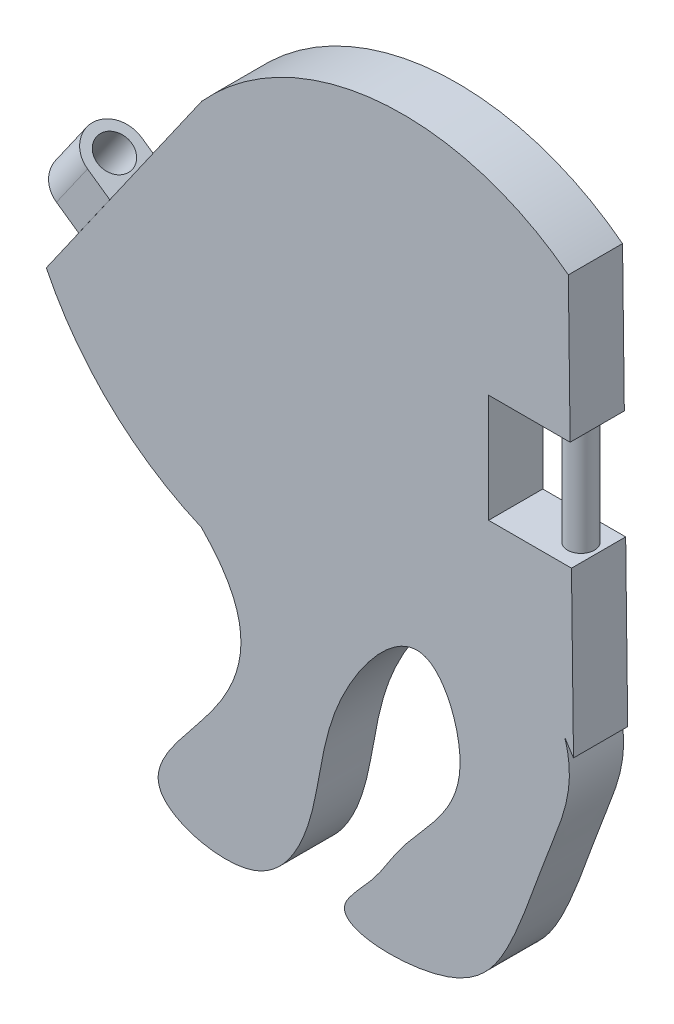
ISO-10303-21;
HEADER;
FILE_DESCRIPTION(('STEP AP214'),'2;1');
FILE_NAME('part.step','',(''),(''),'','','');
FILE_SCHEMA(('AUTOMOTIVE_DESIGN { 1 0 10303 214 1 1 1 1 }'));
ENDSEC;
DATA;
#1=APPLICATION_CONTEXT('core data for automotive mechanical design processes');
#2=APPLICATION_PROTOCOL_DEFINITION('international standard','automotive_design',2000,#1);
#3=PRODUCT_CONTEXT('',#1,'mechanical');
#4=PRODUCT('Part','Part','',(#3));
#5=PRODUCT_RELATED_PRODUCT_CATEGORY('part','',(#4));
#6=PRODUCT_DEFINITION_FORMATION('','',#4);
#7=PRODUCT_DEFINITION_CONTEXT('part definition',#1,'design');
#8=PRODUCT_DEFINITION('design','',#6,#7);
#9=PRODUCT_DEFINITION_SHAPE('','',#8);
#10=(LENGTH_UNIT() NAMED_UNIT(*) SI_UNIT(.MILLI.,.METRE.));
#11=(NAMED_UNIT(*) PLANE_ANGLE_UNIT() SI_UNIT($,.RADIAN.));
#12=(NAMED_UNIT(*) SI_UNIT($,.STERADIAN.) SOLID_ANGLE_UNIT());
#13=UNCERTAINTY_MEASURE_WITH_UNIT(LENGTH_MEASURE(1.E-05),#10,'distance_accuracy_value','');
#14=(GEOMETRIC_REPRESENTATION_CONTEXT(3) GLOBAL_UNCERTAINTY_ASSIGNED_CONTEXT((#13)) GLOBAL_UNIT_ASSIGNED_CONTEXT((#10,
#11,#12)) REPRESENTATION_CONTEXT('',''));
#15=CARTESIAN_POINT('',(0.,0.,0.));
#16=DIRECTION('',(0.,0.,1.));
#17=DIRECTION('',(1.,0.,0.));
#18=AXIS2_PLACEMENT_3D('',#15,#16,#17);
#19=CARTESIAN_POINT('',(-52.7839333186767,28.0995546396019,3.03373966602649));
#20=DIRECTION('',(-0.57357643635105,-0.819152044288989,0.));
#21=DIRECTION('',(0.819152044288989,-0.57357643635105,0.));
#22=AXIS2_PLACEMENT_3D('',#19,#20,#21);
#23=CYLINDRICAL_SURFACE('',#22,3.);
#24=CARTESIAN_POINT('',(-56.225391936783,23.184642373868,3.03373966602649));
#25=DIRECTION('',(0.57357643635105,0.819152044288989,0.));
#26=DIRECTION('',(-0.819152044288989,0.57357643635105,0.));
#27=AXIS2_PLACEMENT_3D('',#24,#25,#26);
#28=CIRCLE('',#27,3.);
#29=CARTESIAN_POINT('',(-56.225391936783,23.184642373868,0.0337396660264923));
#30=VERTEX_POINT('',#29);
#31=CARTESIAN_POINT('',(-56.225391936783,23.184642373868,6.03373966602649));
#32=VERTEX_POINT('',#31);
#33=EDGE_CURVE('E117',#30,#32,#28,.T.);
#34=ORIENTED_EDGE('',*,*,#33,.T.);
#35=DIRECTION('',(-0.57357643635105,-0.819152044288989,0.));
#36=VECTOR('',#35,1.);
#37=CARTESIAN_POINT('',(-52.7839333186767,28.0995546396019,6.03373966602649));
#38=LINE('',#37,#36);
#39=CARTESIAN_POINT('',(-52.7839333186767,28.0995546396019,6.03373966602649));
#40=VERTEX_POINT('',#39);
#41=EDGE_CURVE('E12',#40,#32,#38,.T.);
#42=ORIENTED_EDGE('',*,*,#41,.F.);
#43=CARTESIAN_POINT('',(-52.7839333186767,28.0995546396019,3.03373966602649));
#44=DIRECTION('',(0.57357643635105,0.819152044288989,0.));
#45=DIRECTION('',(-0.819152044288989,0.57357643635105,0.));
#46=AXIS2_PLACEMENT_3D('',#43,#44,#45);
#47=CIRCLE('',#46,3.);
#48=CARTESIAN_POINT('',(-52.7839333186767,28.0995546396019,0.0337396660264923));
#49=VERTEX_POINT('',#48);
#50=EDGE_CURVE('E106',#49,#40,#47,.T.);
#51=ORIENTED_EDGE('',*,*,#50,.F.);
#52=DIRECTION('',(-0.57357643635105,-0.819152044288989,0.));
#53=VECTOR('',#52,1.);
#54=CARTESIAN_POINT('',(-52.7839333186767,28.0995546396019,0.0337396660264923));
#55=LINE('',#54,#53);
#56=EDGE_CURVE('E112',#49,#30,#55,.T.);
#57=ORIENTED_EDGE('',*,*,#56,.T.);
#58=EDGE_LOOP('',(#34,#42,#51,#57));
#59=FACE_BOUND('',#58,.T.);
#60=ADVANCED_FACE('F54',(#59),#23,.T.);
#61=CARTESIAN_POINT('',(-52.7839333186767,28.0995546396019,6.03373966602649));
#62=DIRECTION('',(0.,0.,-1.));
#63=DIRECTION('',(-1.,0.,0.));
#64=AXIS2_PLACEMENT_3D('',#61,#62,#63);
#65=PLANE('',#64);
#66=DIRECTION('',(0.819152044288989,-0.57357643635105,0.));
#67=VECTOR('',#66,1.);
#68=CARTESIAN_POINT('',(-56.225391936783,23.184642373868,6.03373966602649));
#69=LINE('',#68,#67);
#70=CARTESIAN_POINT('',(-53.767935803916,21.4639130648148,6.03373966602649));
#71=VERTEX_POINT('',#70);
#72=EDGE_CURVE('E109',#32,#71,#69,.T.);
#73=ORIENTED_EDGE('',*,*,#72,.T.);
#74=DIRECTION('',(-0.57357643635105,-0.819152044288989,0.));
#75=VECTOR('',#74,1.);
#76=CARTESIAN_POINT('',(-50.3264771858097,26.3788253305488,6.03373966602649));
#77=LINE('',#76,#75);
#78=CARTESIAN_POINT('',(-50.3264771858097,26.3788253305488,6.03373966602649));
#79=VERTEX_POINT('',#78);
#80=EDGE_CURVE('E64',#79,#71,#77,.T.);
#81=ORIENTED_EDGE('',*,*,#80,.F.);
#82=DIRECTION('',(0.819152044288989,-0.57357643635105,0.));
#83=VECTOR('',#82,1.);
#84=CARTESIAN_POINT('',(-52.7839333186767,28.0995546396019,6.03373966602649));
#85=LINE('',#84,#83);
#86=EDGE_CURVE('E103',#40,#79,#85,.T.);
#87=ORIENTED_EDGE('',*,*,#86,.F.);
#88=ORIENTED_EDGE('',*,*,#41,.T.);
#89=EDGE_LOOP('',(#73,#81,#87,#88));
#90=FACE_BOUND('',#89,.T.);
#91=ADVANCED_FACE('F107',(#90),#65,.F.);
#92=CARTESIAN_POINT('',(-50.3264771858097,26.3788253305488,6.03373966602649));
#93=DIRECTION('',(-0.819152044288989,0.57357643635105,0.));
#94=DIRECTION('',(-0.57357643635105,-0.819152044288989,0.));
#95=AXIS2_PLACEMENT_3D('',#92,#93,#94);
#96=PLANE('',#95);
#97=DIRECTION('',(0.,0.,-1.));
#98=VECTOR('',#97,1.);
#99=CARTESIAN_POINT('',(-53.767935803916,21.4639130648148,6.03373966602649));
#100=LINE('',#99,#98);
#101=CARTESIAN_POINT('',(-53.767935803916,21.4639130648148,0.0337396660264923));
#102=VERTEX_POINT('',#101);
#103=EDGE_CURVE('E89',#71,#102,#100,.T.);
#104=ORIENTED_EDGE('',*,*,#103,.T.);
#105=DIRECTION('',(-0.57357643635105,-0.819152044288989,0.));
#106=VECTOR('',#105,1.);
#107=CARTESIAN_POINT('',(-50.3264771858097,26.3788253305488,0.0337396660264923));
#108=LINE('',#107,#106);
#109=CARTESIAN_POINT('',(-50.3264771858097,26.3788253305488,0.0337396660264923));
#110=VERTEX_POINT('',#109);
#111=EDGE_CURVE('E111',#110,#102,#108,.T.);
#112=ORIENTED_EDGE('',*,*,#111,.F.);
#113=DIRECTION('',(0.,0.,-1.));
#114=VECTOR('',#113,1.);
#115=CARTESIAN_POINT('',(-50.3264771858097,26.3788253305488,6.03373966602649));
#116=LINE('',#115,#114);
#117=EDGE_CURVE('E104',#79,#110,#116,.T.);
#118=ORIENTED_EDGE('',*,*,#117,.F.);
#119=ORIENTED_EDGE('',*,*,#80,.T.);
#120=EDGE_LOOP('',(#104,#112,#118,#119));
#121=FACE_BOUND('',#120,.T.);
#122=ADVANCED_FACE('F115',(#121),#96,.F.);
#123=CARTESIAN_POINT('',(-52.7839333186767,28.0995546396019,0.0337396660264923));
#124=DIRECTION('',(0.,0.,1.));
#125=DIRECTION('',(1.,0.,0.));
#126=AXIS2_PLACEMENT_3D('',#123,#124,#125);
#127=PLANE('',#126);
#128=DIRECTION('',(-0.819152044288989,0.57357643635105,0.));
#129=VECTOR('',#128,1.);
#130=CARTESIAN_POINT('',(-56.225391936783,23.184642373868,0.0337396660264923));
#131=LINE('',#130,#129);
#132=EDGE_CURVE('E95',#102,#30,#131,.T.);
#133=ORIENTED_EDGE('',*,*,#132,.T.);
#134=ORIENTED_EDGE('',*,*,#56,.F.);
#135=DIRECTION('',(-0.819152044288989,0.57357643635105,0.));
#136=VECTOR('',#135,1.);
#137=CARTESIAN_POINT('',(-52.7839333186767,28.0995546396019,0.0337396660264923));
#138=LINE('',#137,#136);
#139=EDGE_CURVE('E73',#110,#49,#138,.T.);
#140=ORIENTED_EDGE('',*,*,#139,.F.);
#141=ORIENTED_EDGE('',*,*,#111,.T.);
#142=EDGE_LOOP('',(#133,#134,#140,#141));
#143=FACE_BOUND('',#142,.T.);
#144=ADVANCED_FACE('F127',(#143),#127,.F.);
#145=CARTESIAN_POINT('',(-52.7839333186767,28.0995546396019,3.03373966602649));
#146=DIRECTION('',(0.57357643635105,0.819152044288989,0.));
#147=DIRECTION('',(-0.819152044288989,0.57357643635105,0.));
#148=AXIS2_PLACEMENT_3D('',#145,#146,#147);
#149=PLANE('',#148);
#150=CARTESIAN_POINT('',(-52.8064758772176,28.1153391090228,3.03373966602649));
#151=DIRECTION('',(0.57357643635105,0.819152044288989,0.));
#152=DIRECTION('',(-0.819152044288989,0.57357643635105,0.));
#153=AXIS2_PLACEMENT_3D('',#150,#151,#152);
#154=CIRCLE('',#153,1.9);
#155=CARTESIAN_POINT('',(-54.3628647613667,29.2051343380898,3.03373966602649));
#156=VERTEX_POINT('',#155);
#157=EDGE_CURVE('E135',#156,#156,#154,.T.);
#158=ORIENTED_EDGE('',*,*,#157,.F.);
#159=EDGE_LOOP('',(#158));
#160=FACE_BOUND('',#159,.T.);
#161=ORIENTED_EDGE('',*,*,#50,.T.);
#162=ORIENTED_EDGE('',*,*,#86,.T.);
#163=ORIENTED_EDGE('',*,*,#117,.T.);
#164=ORIENTED_EDGE('',*,*,#139,.T.);
#165=EDGE_LOOP('',(#161,#162,#163,#164));
#166=FACE_BOUND('',#165,.T.);
#167=ADVANCED_FACE('F105',(#160,#166),#149,.T.);
#168=CARTESIAN_POINT('',(-56.225391936783,23.184642373868,3.03373966602649));
#169=DIRECTION('',(0.57357643635105,0.819152044288989,0.));
#170=DIRECTION('',(-0.819152044288989,0.57357643635105,0.));
#171=AXIS2_PLACEMENT_3D('',#168,#169,#170);
#172=PLANE('',#171);
#173=CARTESIAN_POINT('',(-56.2479344953239,23.2004268432889,3.03373966602649));
#174=DIRECTION('',(0.57357643635105,0.819152044288989,0.));
#175=DIRECTION('',(-0.819152044288989,0.57357643635105,0.));
#176=AXIS2_PLACEMENT_3D('',#173,#174,#175);
#177=CIRCLE('',#176,1.9);
#178=CARTESIAN_POINT('',(-57.804323379473,24.2902220723559,3.03373966602649));
#179=VERTEX_POINT('',#178);
#180=EDGE_CURVE('E122',#179,#179,#177,.T.);
#181=ORIENTED_EDGE('',*,*,#180,.T.);
#182=EDGE_LOOP('',(#181));
#183=FACE_BOUND('',#182,.T.);
#184=ORIENTED_EDGE('',*,*,#33,.F.);
#185=ORIENTED_EDGE('',*,*,#132,.F.);
#186=ORIENTED_EDGE('',*,*,#103,.F.);
#187=ORIENTED_EDGE('',*,*,#72,.F.);
#188=EDGE_LOOP('',(#184,#185,#186,#187));
#189=FACE_BOUND('',#188,.T.);
#190=ADVANCED_FACE('F126',(#183,#189),#172,.F.);
#191=CARTESIAN_POINT('',(-56.2479344953239,23.2004268432889,3.03373966602649));
#192=DIRECTION('',(0.57357643635105,0.819152044288989,0.));
#193=DIRECTION('',(-0.819152044288989,0.57357643635105,0.));
#194=AXIS2_PLACEMENT_3D('',#191,#192,#193);
#195=CYLINDRICAL_SURFACE('',#194,1.9);
#196=CARTESIAN_POINT('',(-57.804323379473,24.2902220723559,3.03373966602649));
#197=CARTESIAN_POINT('',(-57.7684748522011,24.341419075124,3.03373966602649));
#198=CARTESIAN_POINT('',(-57.7326263249291,24.392616077892,3.03373966602649));
#199=CARTESIAN_POINT('',(-57.6609292703853,24.4950100834282,3.03373966602649));
#200=CARTESIAN_POINT('',(-57.6250807431133,24.5462070861962,3.03373966602649));
#201=CARTESIAN_POINT('',(-57.5533836885694,24.6486010917323,3.03373966602649));
#202=CARTESIAN_POINT('',(-57.5175351612975,24.6997980945004,3.03373966602649));
#203=CARTESIAN_POINT('',(-57.4458381067536,24.8021921000365,3.03373966602649));
#204=CARTESIAN_POINT('',(-57.4099895794817,24.8533891028046,3.03373966602649));
#205=CARTESIAN_POINT('',(-57.3382925249378,24.9557831083407,3.03373966602649));
#206=CARTESIAN_POINT('',(-57.3024439976658,25.0069801111088,3.03373966602649));
#207=CARTESIAN_POINT('',(-57.230746943122,25.1093741166449,3.03373966602649));
#208=CARTESIAN_POINT('',(-57.19489841585,25.160571119413,3.03373966602649));
#209=CARTESIAN_POINT('',(-57.1232013613062,25.2629651249491,3.03373966602649));
#210=CARTESIAN_POINT('',(-57.0873528340342,25.3141621277171,3.03373966602649));
#211=CARTESIAN_POINT('',(-57.0156557794903,25.4165561332533,3.03373966602649));
#212=CARTESIAN_POINT('',(-56.9798072522184,25.4677531360213,3.03373966602649));
#213=CARTESIAN_POINT('',(-56.9081101976745,25.5701471415575,3.03373966602649));
#214=CARTESIAN_POINT('',(-56.8722616704026,25.6213441443255,3.03373966602649));
#215=CARTESIAN_POINT('',(-56.8005646158587,25.7237381498616,3.03373966602649));
#216=CARTESIAN_POINT('',(-56.7647160885867,25.7749351526297,3.03373966602649));
#217=CARTESIAN_POINT('',(-56.6930190340429,25.8773291581658,3.03373966602649));
#218=CARTESIAN_POINT('',(-56.6571705067709,25.9285261609339,3.03373966602649));
#219=CARTESIAN_POINT('',(-56.585473452227,26.03092016647,3.03373966602649));
#220=CARTESIAN_POINT('',(-56.5496249249551,26.0821171692381,3.03373966602649));
#221=CARTESIAN_POINT('',(-56.4779278704112,26.1845111747742,3.03373966602649));
#222=CARTESIAN_POINT('',(-56.4420793431393,26.2357081775423,3.03373966602649));
#223=CARTESIAN_POINT('',(-56.3703822885954,26.3381021830784,3.03373966602649));
#224=CARTESIAN_POINT('',(-56.3345337613235,26.3892991858464,3.03373966602649));
#225=CARTESIAN_POINT('',(-56.2628367067796,26.4916931913826,3.03373966602649));
#226=CARTESIAN_POINT('',(-56.2269881795076,26.5428901941506,3.03373966602649));
#227=CARTESIAN_POINT('',(-56.1552911249638,26.6452841996868,3.03373966602649));
#228=CARTESIAN_POINT('',(-56.1194425976918,26.6964812024548,3.03373966602649));
#229=CARTESIAN_POINT('',(-56.0477455431479,26.7988752079909,3.03373966602649));
#230=CARTESIAN_POINT('',(-56.011897015876,26.850072210759,3.03373966602649));
#231=CARTESIAN_POINT('',(-55.9401999613321,26.9524662162951,3.03373966602649));
#232=CARTESIAN_POINT('',(-55.9043514340602,27.0036632190632,3.03373966602649));
#233=CARTESIAN_POINT('',(-55.8326543795163,27.1060572245993,3.03373966602649));
#234=CARTESIAN_POINT('',(-55.7968058522443,27.1572542273674,3.03373966602649));
#235=CARTESIAN_POINT('',(-55.7251087977005,27.2596482329035,3.03373966602649));
#236=CARTESIAN_POINT('',(-55.6892602704285,27.3108452356716,3.03373966602649));
#237=CARTESIAN_POINT('',(-55.6175632158846,27.4132392412077,3.03373966602649));
#238=CARTESIAN_POINT('',(-55.5817146886127,27.4644362439757,3.03373966602649));
#239=CARTESIAN_POINT('',(-55.5100176340688,27.5668302495119,3.03373966602649));
#240=CARTESIAN_POINT('',(-55.4741691067969,27.6180272522799,3.03373966602649));
#241=CARTESIAN_POINT('',(-55.402472052253,27.7204212578161,3.03373966602649));
#242=CARTESIAN_POINT('',(-55.3666235249811,27.7716182605841,3.03373966602649));
#243=CARTESIAN_POINT('',(-55.2949264704372,27.8740122661202,3.03373966602649));
#244=CARTESIAN_POINT('',(-55.2590779431652,27.9252092688883,3.03373966602649));
#245=CARTESIAN_POINT('',(-55.1873808886213,28.0276032744244,3.03373966602649));
#246=CARTESIAN_POINT('',(-55.1515323613494,28.0788002771925,3.03373966602649));
#247=CARTESIAN_POINT('',(-55.0798353068055,28.1811942827286,3.03373966602649));
#248=CARTESIAN_POINT('',(-55.0439867795336,28.2323912854967,3.03373966602649));
#249=CARTESIAN_POINT('',(-54.9722897249897,28.3347852910328,3.03373966602649));
#250=CARTESIAN_POINT('',(-54.9364411977178,28.3859822938009,3.03373966602649));
#251=CARTESIAN_POINT('',(-54.8647441431739,28.488376299337,3.03373966602649));
#252=CARTESIAN_POINT('',(-54.8288956159019,28.539573302105,3.03373966602649));
#253=CARTESIAN_POINT('',(-54.7571985613581,28.6419673076412,3.03373966602649));
#254=CARTESIAN_POINT('',(-54.7213500340861,28.6931643104092,3.03373966602649));
#255=CARTESIAN_POINT('',(-54.6496529795422,28.7955583159453,3.03373966602649));
#256=CARTESIAN_POINT('',(-54.6138044522703,28.8467553187134,3.03373966602649));
#257=CARTESIAN_POINT('',(-54.5421073977264,28.9491493242495,3.03373966602649));
#258=CARTESIAN_POINT('',(-54.5062588704545,29.0003463270176,3.03373966602649));
#259=CARTESIAN_POINT('',(-54.4345618159106,29.1027403325537,3.03373966602649));
#260=CARTESIAN_POINT('',(-54.3987132886387,29.1539373353218,3.03373966602649));
#261=CARTESIAN_POINT('',(-54.3628647613667,29.2051343380898,3.03373966602649));
#262=B_SPLINE_CURVE_WITH_KNOTS('',3,(#196,#197,#198,#199,#200,#201,#202,#203,#204,#205,#206,
#207,#208,#209,#210,#211,#212,#213,#214,#215,#216,#217,#218,#219,#220,#221,#222,#223,#224,#225,
#226,#227,#228,#229,#230,#231,#232,#233,#234,#235,#236,#237,#238,#239,#240,#241,#242,#243,#244,
#245,#246,#247,#248,#249,#250,#251,#252,#253,#254,#255,#256,#257,#258,#259,#260,#261),
.UNSPECIFIED.,.F.,.F.,(4,2,2,2,2,2,2,2,2,2,2,2,2,2,2,2,2,2,2,2,2,2,2,2,2,2,2,2,2,2,2,2,4),(0.,
0.187500000000005,0.375000000000002,0.562500000000004,0.750000000000002,0.937500000000004,1.125,
1.3125,1.5,1.6875,1.875,2.0625,2.25,2.4375,2.625,2.8125,3.,3.1875,3.375,3.5625,3.75,3.9375,
4.125,4.3125,4.5,4.6875,4.875,5.0625,5.25,5.4375,5.625,5.8125,6.),.UNSPECIFIED.);
#263=EDGE_CURVE('BSEAM140',#179,#156,#262,.T.);
#264=ORIENTED_EDGE('',*,*,#180,.F.);
#265=ORIENTED_EDGE('',*,*,#157,.T.);
#266=ORIENTED_EDGE('',*,*,#263,.T.);
#267=ORIENTED_EDGE('',*,*,#263,.F.);
#268=EDGE_LOOP('',(#264,#266,#265,#267));
#269=FACE_BOUND('',#268,.T.);
#270=ADVANCED_FACE('F140',(#269),#195,.F.);
#271=CLOSED_SHELL('',(#60,#91,#122,#144,#167,#190,#270));
#272=MANIFOLD_SOLID_BREP('B2',#271);
#273=CARTESIAN_POINT('',(-40.220004180602,0.,6.));
#274=CARTESIAN_POINT('',(-34.2016114290309,-6.05857153487984,6.));
#275=CARTESIAN_POINT('',(-35.2745368281639,-14.5917820230503,6.));
#276=CARTESIAN_POINT('',(-49.711449450992,-28.3237956630984,6.));
#277=CARTESIAN_POINT('',(-33.871045739327,-32.3364863682366,6.));
#278=CARTESIAN_POINT('',(-26.6871370843401,-21.6700080332007,6.));
#279=CARTESIAN_POINT('',(-27.7721809862612,-10.7107741147985,6.));
#280=CARTESIAN_POINT('',(-15.3909183517906,5.22400249894245,6.));
#281=CARTESIAN_POINT('',(-9.06207190763495,-11.3740924754963,6.));
#282=CARTESIAN_POINT('',(-17.4736594031644,-17.8416543140469,6.));
#283=CARTESIAN_POINT('',(-20.7431278633314,-24.1498288647821,6.));
#284=CARTESIAN_POINT('',(-27.9498085853597,-30.8509284996658,6.));
#285=CARTESIAN_POINT('',(-10.8414612486033,-31.1729678891338,6.));
#286=CARTESIAN_POINT('',(-5.25729297512429,-22.1051933966457,6.));
#287=CARTESIAN_POINT('',(-1.90756269576761,-11.4466036991554,6.));
#288=CARTESIAN_POINT('',(1.42039043748981,-4.29979612211648,6.));
#289=CARTESIAN_POINT('',(0.,0.,6.));
#290=B_SPLINE_CURVE_WITH_KNOTS('',3,(#273,#274,#275,#276,#277,#278,#279,#280,#281,#282,#283,
#284,#285,#286,#287,#288,#289),.UNSPECIFIED.,.F.,.F.,(4,1,1,1,1,1,1,1,1,1,1,1,1,1,4),(0.,
0.121585933528169,0.195478989441782,0.26389434539242,0.316088540522773,0.416782734240164,
0.499739253540205,0.563363999439979,0.643025816240053,0.680698341267649,0.711560876296808,
0.787425607848856,0.849631035891599,0.922420179179729,1.),.UNSPECIFIED.);
#291=DIRECTION('',(0.,0.,-1.));
#292=VECTOR('',#291,1.);
#293=SURFACE_OF_LINEAR_EXTRUSION('',#290,#292);
#294=CARTESIAN_POINT('',(-40.220004180602,0.,0.));
#295=CARTESIAN_POINT('',(-34.2016114290309,-6.05857153487984,0.));
#296=CARTESIAN_POINT('',(-35.2745368281639,-14.5917820230503,0.));
#297=CARTESIAN_POINT('',(-49.711449450992,-28.3237956630984,0.));
#298=CARTESIAN_POINT('',(-33.871045739327,-32.3364863682366,0.));
#299=CARTESIAN_POINT('',(-26.6871370843401,-21.6700080332007,0.));
#300=CARTESIAN_POINT('',(-27.7721809862612,-10.7107741147985,0.));
#301=CARTESIAN_POINT('',(-15.3909183517906,5.22400249894245,0.));
#302=CARTESIAN_POINT('',(-9.06207190763495,-11.3740924754963,0.));
#303=CARTESIAN_POINT('',(-17.4736594031644,-17.8416543140469,0.));
#304=CARTESIAN_POINT('',(-20.7431278633314,-24.1498288647821,0.));
#305=CARTESIAN_POINT('',(-27.9498085853597,-30.8509284996658,0.));
#306=CARTESIAN_POINT('',(-10.8414612486033,-31.1729678891338,0.));
#307=CARTESIAN_POINT('',(-5.25729297512429,-22.1051933966457,0.));
#308=CARTESIAN_POINT('',(-1.90756269576761,-11.4466036991554,0.));
#309=CARTESIAN_POINT('',(1.42039043748981,-4.29979612211648,0.));
#310=CARTESIAN_POINT('',(0.,0.,0.));
#311=B_SPLINE_CURVE_WITH_KNOTS('',3,(#294,#295,#296,#297,#298,#299,#300,#301,#302,#303,#304,
#305,#306,#307,#308,#309,#310),.UNSPECIFIED.,.F.,.F.,(4,1,1,1,1,1,1,1,1,1,1,1,1,1,4),(0.,
0.121585933528169,0.195478989441782,0.26389434539242,0.316088540522773,0.416782734240164,
0.499739253540205,0.563363999439979,0.643025816240053,0.680698341267649,0.711560876296808,
0.787425607848856,0.849631035891599,0.922420179179729,1.),.UNSPECIFIED.);
#312=CARTESIAN_POINT('',(-40.220004180602,0.,0.));
#313=VERTEX_POINT('',#312);
#314=CARTESIAN_POINT('',(0.,0.,0.));
#315=VERTEX_POINT('',#314);
#316=EDGE_CURVE('E318',#313,#315,#311,.T.);
#317=ORIENTED_EDGE('',*,*,#316,.T.);
#318=DIRECTION('',(0.,0.,-1.));
#319=VECTOR('',#318,1.);
#320=CARTESIAN_POINT('',(0.,0.,6.));
#321=LINE('',#320,#319);
#322=CARTESIAN_POINT('',(0.,0.,6.));
#323=VERTEX_POINT('',#322);
#324=EDGE_CURVE('E354',#323,#315,#321,.T.);
#325=ORIENTED_EDGE('',*,*,#324,.F.);
#326=CARTESIAN_POINT('',(-40.220004180602,0.,6.));
#327=VERTEX_POINT('',#326);
#328=EDGE_CURVE('E313',#327,#323,#290,.T.);
#329=ORIENTED_EDGE('',*,*,#328,.F.);
#330=DIRECTION('',(0.,0.,-1.));
#331=VECTOR('',#330,1.);
#332=CARTESIAN_POINT('',(-40.220004180602,0.,6.));
#333=LINE('',#332,#331);
#334=EDGE_CURVE('E316',#327,#313,#333,.T.);
#335=ORIENTED_EDGE('',*,*,#334,.T.);
#336=EDGE_LOOP('',(#317,#325,#329,#335));
#337=FACE_BOUND('',#336,.T.);
#338=ADVANCED_FACE('F198',(#337),#293,.F.);
#339=CARTESIAN_POINT('',(0.,0.,6.));
#340=DIRECTION('',(0.837301542843187,0.546741370624557,0.));
#341=DIRECTION('',(-0.546741370624557,0.837301542843187,0.));
#342=AXIS2_PLACEMENT_3D('',#339,#340,#341);
#343=PLANE('',#342);
#344=DIRECTION('',(0.546741370624557,-0.837301542843187,0.));
#345=VECTOR('',#344,1.);
#346=CARTESIAN_POINT('',(0.,0.,0.));
#347=LINE('',#346,#345);
#348=CARTESIAN_POINT('',(0.985522663989314,-1.50926871716797,0.));
#349=VERTEX_POINT('',#348);
#350=EDGE_CURVE('E327',#315,#349,#347,.T.);
#351=ORIENTED_EDGE('',*,*,#350,.T.);
#352=DIRECTION('',(0.,0.,1.));
#353=VECTOR('',#352,1.);
#354=CARTESIAN_POINT('',(0.985522663989313,-1.50926871716797,6.));
#355=LINE('',#354,#353);
#356=CARTESIAN_POINT('',(0.985522663989314,-1.50926871716801,6.));
#357=VERTEX_POINT('',#356);
#358=EDGE_CURVE('E290',#349,#357,#355,.T.);
#359=ORIENTED_EDGE('',*,*,#358,.T.);
#360=DIRECTION('',(0.546741370624557,-0.837301542843187,0.));
#361=VECTOR('',#360,1.);
#362=CARTESIAN_POINT('',(0.,0.,6.));
#363=LINE('',#362,#361);
#364=EDGE_CURVE('E310',#323,#357,#363,.T.);
#365=ORIENTED_EDGE('',*,*,#364,.F.);
#366=ORIENTED_EDGE('',*,*,#324,.T.);
#367=EDGE_LOOP('',(#351,#359,#365,#366));
#368=FACE_BOUND('',#367,.T.);
#369=ADVANCED_FACE('F414',(#368),#343,.F.);
#370=CARTESIAN_POINT('',(-17.9089498190664,20.7706725408957,6.));
#371=DIRECTION('',(0.,0.,-1.));
#372=DIRECTION('',(-1.,0.,0.));
#373=AXIS2_PLACEMENT_3D('',#370,#371,#372);
#374=CYLINDRICAL_SURFACE('',#373,30.);
#375=CARTESIAN_POINT('',(-17.9089498190664,20.7706725408957,6.));
#376=DIRECTION('',(0.,0.,1.));
#377=DIRECTION('',(-1.,0.,0.));
#378=AXIS2_PLACEMENT_3D('',#375,#376,#377);
#379=CIRCLE('',#378,30.);
#380=CARTESIAN_POINT('',(0.415250858095337,44.5240653415696,6.));
#381=VERTEX_POINT('',#380);
#382=CARTESIAN_POINT('',(-40.1770796552289,40.8736671834809,6.));
#383=VERTEX_POINT('',#382);
#384=EDGE_CURVE('E295',#381,#383,#379,.T.);
#385=ORIENTED_EDGE('',*,*,#384,.F.);
#386=DIRECTION('',(0.,0.,-1.));
#387=VECTOR('',#386,1.);
#388=CARTESIAN_POINT('',(0.415250858095344,44.5240653415696,6.));
#389=LINE('',#388,#387);
#390=CARTESIAN_POINT('',(0.415250858095344,44.5240653415696,0.));
#391=VERTEX_POINT('',#390);
#392=EDGE_CURVE('E280',#381,#391,#389,.T.);
#393=ORIENTED_EDGE('',*,*,#392,.T.);
#394=CARTESIAN_POINT('',(-17.9089498190664,20.7706725408957,0.));
#395=DIRECTION('',(0.,0.,1.));
#396=DIRECTION('',(-1.,0.,0.));
#397=AXIS2_PLACEMENT_3D('',#394,#395,#396);
#398=CIRCLE('',#397,30.);
#399=CARTESIAN_POINT('',(-40.1770796552289,40.8736671834809,0.));
#400=VERTEX_POINT('',#399);
#401=EDGE_CURVE('E335',#391,#400,#398,.T.);
#402=ORIENTED_EDGE('',*,*,#401,.T.);
#403=DIRECTION('',(0.,0.,-1.));
#404=VECTOR('',#403,1.);
#405=CARTESIAN_POINT('',(-40.1770796552289,40.8736671834809,6.));
#406=LINE('',#405,#404);
#407=EDGE_CURVE('E303',#383,#400,#406,.T.);
#408=ORIENTED_EDGE('',*,*,#407,.F.);
#409=EDGE_LOOP('',(#385,#393,#402,#408));
#410=FACE_BOUND('',#409,.T.);
#411=ADVANCED_FACE('F301',(#410),#374,.T.);
#412=CARTESIAN_POINT('',(-40.1770796552289,40.8736671834809,6.));
#413=DIRECTION('',(0.819152044288989,-0.57357643635105,0.));
#414=DIRECTION('',(0.57357643635105,0.819152044288989,0.));
#415=AXIS2_PLACEMENT_3D('',#412,#413,#414);
#416=PLANE('',#415);
#417=DIRECTION('',(-0.57357643635105,-0.819152044288989,0.));
#418=VECTOR('',#417,1.);
#419=CARTESIAN_POINT('',(-40.1770796552289,40.8736671834809,0.));
#420=LINE('',#419,#418);
#421=CARTESIAN_POINT('',(-57.3843727457604,16.2991058548113,0.));
#422=VERTEX_POINT('',#421);
#423=EDGE_CURVE('E340',#400,#422,#420,.T.);
#424=ORIENTED_EDGE('',*,*,#423,.T.);
#425=DIRECTION('',(0.,0.,-1.));
#426=VECTOR('',#425,1.);
#427=CARTESIAN_POINT('',(-57.3843727457604,16.2991058548113,6.));
#428=LINE('',#427,#426);
#429=CARTESIAN_POINT('',(-57.3843727457604,16.2991058548113,6.));
#430=VERTEX_POINT('',#429);
#431=EDGE_CURVE('E347',#430,#422,#428,.T.);
#432=ORIENTED_EDGE('',*,*,#431,.F.);
#433=DIRECTION('',(-0.57357643635105,-0.819152044288989,0.));
#434=VECTOR('',#433,1.);
#435=CARTESIAN_POINT('',(-40.1770796552289,40.8736671834809,6.));
#436=LINE('',#435,#434);
#437=EDGE_CURVE('E306',#383,#430,#436,.T.);
#438=ORIENTED_EDGE('',*,*,#437,.F.);
#439=ORIENTED_EDGE('',*,*,#407,.T.);
#440=EDGE_LOOP('',(#424,#432,#438,#439));
#441=FACE_BOUND('',#440,.T.);
#442=ADVANCED_FACE('F436',(#441),#416,.F.);
#443=CARTESIAN_POINT('',(-26.8542011494653,31.2626823758432,6.));
#444=DIRECTION('',(0.,0.,-1.));
#445=DIRECTION('',(-1.,0.,0.));
#446=AXIS2_PLACEMENT_3D('',#443,#444,#445);
#447=CYLINDRICAL_SURFACE('',#446,34.);
#448=CARTESIAN_POINT('',(-26.8542011494653,31.2626823758432,0.));
#449=DIRECTION('',(0.,0.,1.));
#450=DIRECTION('',(1.,0.,0.));
#451=AXIS2_PLACEMENT_3D('',#448,#449,#450);
#452=CIRCLE('',#451,34.);
#453=EDGE_CURVE('E338',#422,#313,#452,.T.);
#454=ORIENTED_EDGE('',*,*,#453,.T.);
#455=ORIENTED_EDGE('',*,*,#334,.F.);
#456=CARTESIAN_POINT('',(-26.8542011494653,31.2626823758432,6.));
#457=DIRECTION('',(0.,0.,1.));
#458=DIRECTION('',(1.,0.,0.));
#459=AXIS2_PLACEMENT_3D('',#456,#457,#458);
#460=CIRCLE('',#459,34.);
#461=EDGE_CURVE('E311',#430,#327,#460,.T.);
#462=ORIENTED_EDGE('',*,*,#461,.F.);
#463=ORIENTED_EDGE('',*,*,#431,.T.);
#464=EDGE_LOOP('',(#454,#455,#462,#463));
#465=FACE_BOUND('',#464,.T.);
#466=ADVANCED_FACE('F433',(#465),#447,.T.);
#467=CARTESIAN_POINT('',(-15.4310347738143,-0.0107895749709303,6.));
#468=DIRECTION('',(0.,0.,1.));
#469=DIRECTION('',(1.,0.,0.));
#470=AXIS2_PLACEMENT_3D('',#467,#468,#469);
#471=PLANE('',#470);
#472=DIRECTION('',(0.0123872855017245,-0.999923274635559,0.));
#473=VECTOR('',#472,1.);
#474=CARTESIAN_POINT('',(0.415250858095337,44.5240653415696,6.));
#475=LINE('',#474,#473);
#476=CARTESIAN_POINT('',(0.612826761548797,28.5753940735376,6.));
#477=VERTEX_POINT('',#476);
#478=EDGE_CURVE('E278',#381,#477,#475,.T.);
#479=ORIENTED_EDGE('',*,*,#478,.F.);
#480=ORIENTED_EDGE('',*,*,#384,.T.);
#481=ORIENTED_EDGE('',*,*,#437,.T.);
#482=ORIENTED_EDGE('',*,*,#461,.T.);
#483=ORIENTED_EDGE('',*,*,#328,.T.);
#484=ORIENTED_EDGE('',*,*,#364,.T.);
#485=CARTESIAN_POINT('',(0.761485593472547,16.5753940735376,6.));
#486=VERTEX_POINT('',#485);
#487=EDGE_CURVE('E299',#486,#357,#475,.T.);
#488=ORIENTED_EDGE('',*,*,#487,.F.);
#489=DIRECTION('',(1.,0.,0.));
#490=VECTOR('',#489,1.);
#491=CARTESIAN_POINT('',(1.58321978358847,16.5753940735376,6.));
#492=LINE('',#491,#490);
#493=CARTESIAN_POINT('',(-8.41678021641153,16.5753940735376,6.));
#494=VERTEX_POINT('',#493);
#495=EDGE_CURVE('E380',#494,#486,#492,.T.);
#496=ORIENTED_EDGE('',*,*,#495,.F.);
#497=DIRECTION('',(0.,-1.,0.));
#498=VECTOR('',#497,1.);
#499=CARTESIAN_POINT('',(-8.41678021641153,28.5753940735376,6.));
#500=LINE('',#499,#498);
#501=CARTESIAN_POINT('',(-8.41678021641153,28.5753940735376,6.));
#502=VERTEX_POINT('',#501);
#503=EDGE_CURVE('E384',#502,#494,#500,.T.);
#504=ORIENTED_EDGE('',*,*,#503,.F.);
#505=DIRECTION('',(-1.,0.,0.));
#506=VECTOR('',#505,1.);
#507=CARTESIAN_POINT('',(1.58321978358847,28.5753940735376,6.));
#508=LINE('',#507,#506);
#509=EDGE_CURVE('E287',#477,#502,#508,.T.);
#510=ORIENTED_EDGE('',*,*,#509,.F.);
#511=EDGE_LOOP('',(#479,#480,#481,#482,#483,#484,#488,#496,#504,#510));
#512=FACE_BOUND('',#511,.T.);
#513=ADVANCED_FACE('F291',(#512),#471,.T.);
#514=CARTESIAN_POINT('',(-15.4310347738143,-0.0107895749709303,0.));
#515=DIRECTION('',(0.,0.,1.));
#516=DIRECTION('',(1.,0.,0.));
#517=AXIS2_PLACEMENT_3D('',#514,#515,#516);
#518=PLANE('',#517);
#519=ORIENTED_EDGE('',*,*,#401,.F.);
#520=DIRECTION('',(0.0123872855017245,-0.999923274635559,0.));
#521=VECTOR('',#520,1.);
#522=CARTESIAN_POINT('',(0.96444296315569,0.192321472463221,0.));
#523=LINE('',#522,#521);
#524=CARTESIAN_POINT('',(0.612826761548797,28.5753940735376,0.));
#525=VERTEX_POINT('',#524);
#526=EDGE_CURVE('E284',#391,#525,#523,.T.);
#527=ORIENTED_EDGE('',*,*,#526,.T.);
#528=DIRECTION('',(-1.,0.,0.));
#529=VECTOR('',#528,1.);
#530=CARTESIAN_POINT('',(1.58321978358847,28.5753940735376,0.));
#531=LINE('',#530,#529);
#532=CARTESIAN_POINT('',(-8.41678021641153,28.5753940735376,0.));
#533=VERTEX_POINT('',#532);
#534=EDGE_CURVE('E367',#525,#533,#531,.T.);
#535=ORIENTED_EDGE('',*,*,#534,.T.);
#536=DIRECTION('',(0.,-1.,0.));
#537=VECTOR('',#536,1.);
#538=CARTESIAN_POINT('',(-8.41678021641153,28.5753940735376,0.));
#539=LINE('',#538,#537);
#540=CARTESIAN_POINT('',(-8.41678021641154,16.5753940735376,0.));
#541=VERTEX_POINT('',#540);
#542=EDGE_CURVE('E376',#533,#541,#539,.T.);
#543=ORIENTED_EDGE('',*,*,#542,.T.);
#544=DIRECTION('',(1.,0.,0.));
#545=VECTOR('',#544,1.);
#546=CARTESIAN_POINT('',(1.58321978358847,16.5753940735376,0.));
#547=LINE('',#546,#545);
#548=CARTESIAN_POINT('',(0.761485593472547,16.5753940735376,0.));
#549=VERTEX_POINT('',#548);
#550=EDGE_CURVE('E222',#541,#549,#547,.T.);
#551=ORIENTED_EDGE('',*,*,#550,.T.);
#552=EDGE_CURVE('E217',#549,#349,#523,.T.);
#553=ORIENTED_EDGE('',*,*,#552,.T.);
#554=ORIENTED_EDGE('',*,*,#350,.F.);
#555=ORIENTED_EDGE('',*,*,#316,.F.);
#556=ORIENTED_EDGE('',*,*,#453,.F.);
#557=ORIENTED_EDGE('',*,*,#423,.F.);
#558=EDGE_LOOP('',(#519,#527,#535,#543,#551,#553,#554,#555,#556,#557));
#559=FACE_BOUND('',#558,.T.);
#560=ADVANCED_FACE('F429',(#559),#518,.F.);
#561=CARTESIAN_POINT('',(1.58321978358847,16.5753940735376,0.));
#562=DIRECTION('',(0.,-1.,0.));
#563=DIRECTION('',(0.,0.,-1.));
#564=AXIS2_PLACEMENT_3D('',#561,#562,#563);
#565=PLANE('',#564);
#566=CARTESIAN_POINT('',(-1.18437948322025,16.5753940735376,3.));
#567=DIRECTION('',(0.,-1.,0.));
#568=DIRECTION('',(0.,0.,-1.));
#569=AXIS2_PLACEMENT_3D('',#566,#567,#568);
#570=CIRCLE('',#569,1.5);
#571=CARTESIAN_POINT('',(-1.18437948322025,16.5753940735376,1.5));
#572=VERTEX_POINT('',#571);
#573=EDGE_CURVE('E52',#572,#572,#570,.F.);
#574=ORIENTED_EDGE('',*,*,#573,.F.);
#575=EDGE_LOOP('',(#574));
#576=FACE_BOUND('',#575,.T.);
#577=ORIENTED_EDGE('',*,*,#495,.T.);
#578=DIRECTION('',(0.,0.,-1.));
#579=VECTOR('',#578,1.);
#580=CARTESIAN_POINT('',(0.761485593472547,16.5753940735376,0.));
#581=LINE('',#580,#579);
#582=EDGE_CURVE('E419',#486,#549,#581,.T.);
#583=ORIENTED_EDGE('',*,*,#582,.T.);
#584=ORIENTED_EDGE('',*,*,#550,.F.);
#585=DIRECTION('',(0.,0.,1.));
#586=VECTOR('',#585,1.);
#587=CARTESIAN_POINT('',(-8.41678021641153,16.5753940735376,0.));
#588=LINE('',#587,#586);
#589=EDGE_CURVE('E330',#541,#494,#588,.T.);
#590=ORIENTED_EDGE('',*,*,#589,.T.);
#591=EDGE_LOOP('',(#577,#583,#584,#590));
#592=FACE_BOUND('',#591,.T.);
#593=ADVANCED_FACE('F430',(#576,#592),#565,.F.);
#594=CARTESIAN_POINT('',(-8.41678021641153,28.5753940735376,0.));
#595=DIRECTION('',(-1.,0.,0.));
#596=DIRECTION('',(0.,-1.,0.));
#597=AXIS2_PLACEMENT_3D('',#594,#595,#596);
#598=PLANE('',#597);
#599=ORIENTED_EDGE('',*,*,#503,.T.);
#600=ORIENTED_EDGE('',*,*,#589,.F.);
#601=ORIENTED_EDGE('',*,*,#542,.F.);
#602=DIRECTION('',(0.,0.,1.));
#603=VECTOR('',#602,1.);
#604=CARTESIAN_POINT('',(-8.41678021641153,28.5753940735376,0.));
#605=LINE('',#604,#603);
#606=EDGE_CURVE('E371',#533,#502,#605,.T.);
#607=ORIENTED_EDGE('',*,*,#606,.T.);
#608=EDGE_LOOP('',(#599,#600,#601,#607));
#609=FACE_BOUND('',#608,.T.);
#610=ADVANCED_FACE('F362',(#609),#598,.F.);
#611=CARTESIAN_POINT('',(1.58321978358847,28.5753940735376,0.));
#612=DIRECTION('',(0.,1.,0.));
#613=DIRECTION('',(0.,0.,1.));
#614=AXIS2_PLACEMENT_3D('',#611,#612,#613);
#615=PLANE('',#614);
#616=CARTESIAN_POINT('',(-1.18437948322025,28.5753940735376,3.));
#617=DIRECTION('',(0.,1.,0.));
#618=DIRECTION('',(0.,0.,1.));
#619=AXIS2_PLACEMENT_3D('',#616,#617,#618);
#620=CIRCLE('',#619,1.5);
#621=CARTESIAN_POINT('',(-1.18437948322025,28.5753940735376,4.5));
#622=VERTEX_POINT('',#621);
#623=EDGE_CURVE('E209',#622,#622,#620,.F.);
#624=ORIENTED_EDGE('',*,*,#623,.F.);
#625=EDGE_LOOP('',(#624));
#626=FACE_BOUND('',#625,.T.);
#627=ORIENTED_EDGE('',*,*,#534,.F.);
#628=DIRECTION('',(0.,0.,1.));
#629=VECTOR('',#628,1.);
#630=CARTESIAN_POINT('',(0.612826761548797,28.5753940735376,0.));
#631=LINE('',#630,#629);
#632=EDGE_CURVE('E296',#525,#477,#631,.T.);
#633=ORIENTED_EDGE('',*,*,#632,.T.);
#634=ORIENTED_EDGE('',*,*,#509,.T.);
#635=ORIENTED_EDGE('',*,*,#606,.F.);
#636=EDGE_LOOP('',(#627,#633,#634,#635));
#637=FACE_BOUND('',#636,.T.);
#638=ADVANCED_FACE('F365',(#626,#637),#615,.F.);
#639=CARTESIAN_POINT('',(-1.18437948322025,-30.4770914392963,3.));
#640=DIRECTION('',(0.,1.,0.));
#641=DIRECTION('',(0.,0.,1.));
#642=AXIS2_PLACEMENT_3D('',#639,#640,#641);
#643=CYLINDRICAL_SURFACE('',#642,1.5);
#644=ORIENTED_EDGE('',*,*,#623,.T.);
#645=EDGE_LOOP('',(#644));
#646=FACE_BOUND('',#645,.T.);
#647=ORIENTED_EDGE('',*,*,#573,.T.);
#648=EDGE_LOOP('',(#647));
#649=FACE_BOUND('',#648,.T.);
#650=ADVANCED_FACE('F360',(#646,#649),#643,.T.);
#651=CARTESIAN_POINT('',(0.415250858095337,44.5240653415696,-4.));
#652=DIRECTION('',(-0.999923274635559,-0.0123872855017245,0.));
#653=DIRECTION('',(0.0123872855017245,-0.999923274635559,0.));
#654=AXIS2_PLACEMENT_3D('',#651,#652,#653);
#655=PLANE('',#654);
#656=ORIENTED_EDGE('',*,*,#392,.F.);
#657=ORIENTED_EDGE('',*,*,#478,.T.);
#658=ORIENTED_EDGE('',*,*,#632,.F.);
#659=ORIENTED_EDGE('',*,*,#526,.F.);
#660=EDGE_LOOP('',(#656,#657,#658,#659));
#661=FACE_BOUND('',#660,.T.);
#662=ADVANCED_FACE('F276',(#661),#655,.F.);
#663=ORIENTED_EDGE('',*,*,#552,.F.);
#664=ORIENTED_EDGE('',*,*,#582,.F.);
#665=ORIENTED_EDGE('',*,*,#487,.T.);
#666=ORIENTED_EDGE('',*,*,#358,.F.);
#667=EDGE_LOOP('',(#663,#664,#665,#666));
#668=FACE_BOUND('',#667,.T.);
#669=ADVANCED_FACE('F424',(#668),#655,.F.);
#670=CLOSED_SHELL('',(#338,#369,#411,#442,#466,#513,#560,#593,#610,#638,#650,#662,#669));
#671=MANIFOLD_SOLID_BREP('B6',#670);
#672=ADVANCED_BREP_SHAPE_REPRESENTATION('',(#18,#272,#671),#14);
#673=SHAPE_DEFINITION_REPRESENTATION(#9,#672);
ENDSEC;
END-ISO-10303-21;
